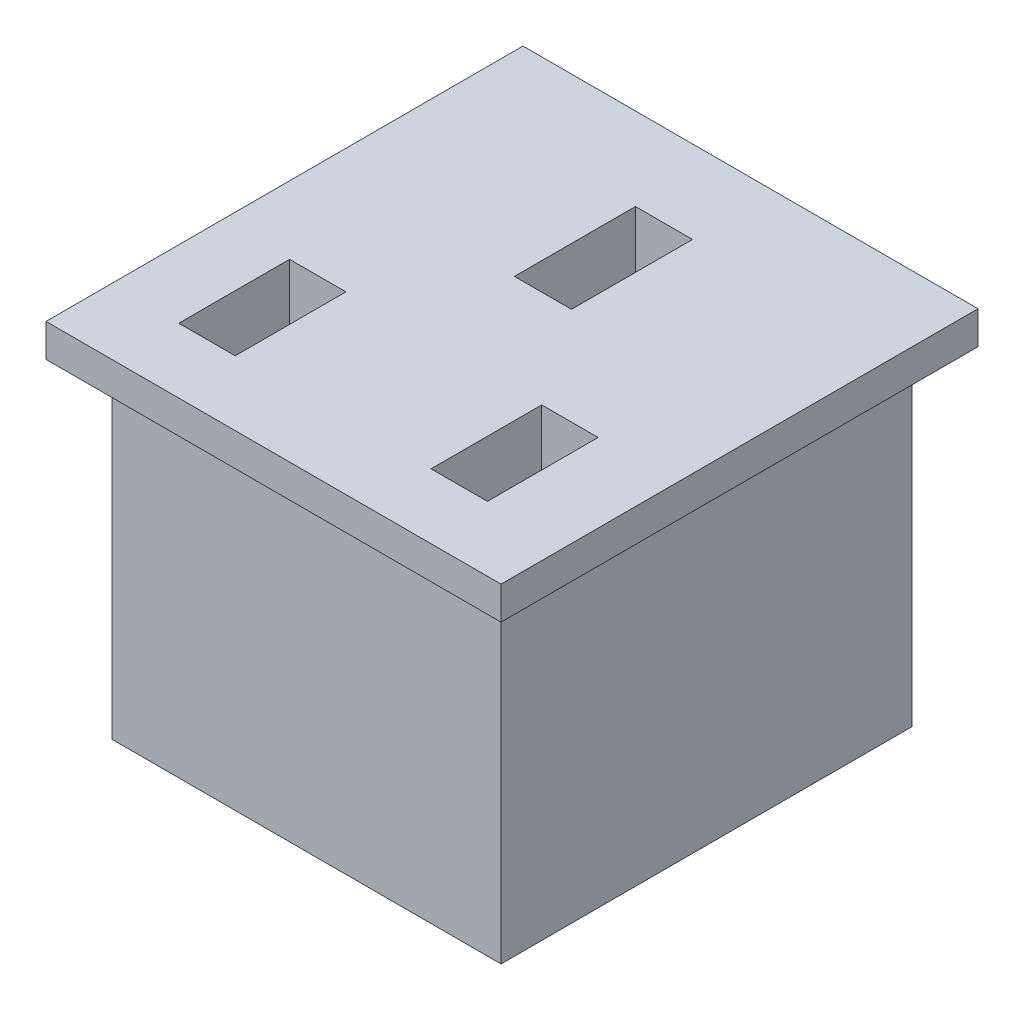
ISO-10303-21;
HEADER;
FILE_DESCRIPTION(('STEP AP214'),'2;1');
FILE_NAME('part.step','',(''),(''),'','','');
FILE_SCHEMA(('AUTOMOTIVE_DESIGN { 1 0 10303 214 1 1 1 1 }'));
ENDSEC;
DATA;
#1=APPLICATION_CONTEXT('core data for automotive mechanical design processes');
#2=APPLICATION_PROTOCOL_DEFINITION('international standard','automotive_design',2000,#1);
#3=PRODUCT_CONTEXT('',#1,'mechanical');
#4=PRODUCT('Part','Part','',(#3));
#5=PRODUCT_RELATED_PRODUCT_CATEGORY('part','',(#4));
#6=PRODUCT_DEFINITION_FORMATION('','',#4);
#7=PRODUCT_DEFINITION_CONTEXT('part definition',#1,'design');
#8=PRODUCT_DEFINITION('design','',#6,#7);
#9=PRODUCT_DEFINITION_SHAPE('','',#8);
#10=(LENGTH_UNIT() NAMED_UNIT(*) SI_UNIT(.MILLI.,.METRE.));
#11=(NAMED_UNIT(*) PLANE_ANGLE_UNIT() SI_UNIT($,.RADIAN.));
#12=(NAMED_UNIT(*) SI_UNIT($,.STERADIAN.) SOLID_ANGLE_UNIT());
#13=UNCERTAINTY_MEASURE_WITH_UNIT(LENGTH_MEASURE(1.E-05),#10,'distance_accuracy_value','');
#14=(GEOMETRIC_REPRESENTATION_CONTEXT(3) GLOBAL_UNCERTAINTY_ASSIGNED_CONTEXT((#13)) GLOBAL_UNIT_ASSIGNED_CONTEXT((#10,
#11,#12)) REPRESENTATION_CONTEXT('',''));
#15=CARTESIAN_POINT('',(0.,0.,0.));
#16=DIRECTION('',(0.,0.,1.));
#17=DIRECTION('',(1.,0.,0.));
#18=AXIS2_PLACEMENT_3D('',#15,#16,#17);
#19=CARTESIAN_POINT('',(17.75,30.,-18.75));
#20=DIRECTION('',(-1.,0.,0.));
#21=DIRECTION('',(0.,0.,1.));
#22=AXIS2_PLACEMENT_3D('',#19,#20,#21);
#23=PLANE('',#22);
#24=DIRECTION('',(0.,0.,-1.));
#25=VECTOR('',#24,1.);
#26=CARTESIAN_POINT('',(17.75,0.,-18.75));
#27=LINE('',#26,#25);
#28=CARTESIAN_POINT('',(17.75,0.,18.75));
#29=VERTEX_POINT('',#28);
#30=CARTESIAN_POINT('',(17.75,0.,-18.75));
#31=VERTEX_POINT('',#30);
#32=EDGE_CURVE('E301',#29,#31,#27,.T.);
#33=ORIENTED_EDGE('',*,*,#32,.T.);
#34=DIRECTION('',(0.,-1.,0.));
#35=VECTOR('',#34,1.);
#36=CARTESIAN_POINT('',(17.75,30.,-18.75));
#37=LINE('',#36,#35);
#38=CARTESIAN_POINT('',(17.75,30.,-18.75));
#39=VERTEX_POINT('',#38);
#40=EDGE_CURVE('E11',#39,#31,#37,.T.);
#41=ORIENTED_EDGE('',*,*,#40,.F.);
#42=DIRECTION('',(0.,0.,-1.));
#43=VECTOR('',#42,1.);
#44=CARTESIAN_POINT('',(17.75,30.,-18.75));
#45=LINE('',#44,#43);
#46=CARTESIAN_POINT('',(17.75,30.,18.75));
#47=VERTEX_POINT('',#46);
#48=EDGE_CURVE('E302',#47,#39,#45,.T.);
#49=ORIENTED_EDGE('',*,*,#48,.F.);
#50=DIRECTION('',(0.,-1.,0.));
#51=VECTOR('',#50,1.);
#52=CARTESIAN_POINT('',(17.75,30.,18.75));
#53=LINE('',#52,#51);
#54=EDGE_CURVE('E315',#47,#29,#53,.T.);
#55=ORIENTED_EDGE('',*,*,#54,.T.);
#56=EDGE_LOOP('',(#33,#41,#49,#55));
#57=FACE_BOUND('',#56,.T.);
#58=ADVANCED_FACE('F35',(#57),#23,.F.);
#59=CARTESIAN_POINT('',(-17.75,30.,-18.75));
#60=DIRECTION('',(0.,0.,1.));
#61=DIRECTION('',(1.,0.,0.));
#62=AXIS2_PLACEMENT_3D('',#59,#60,#61);
#63=PLANE('',#62);
#64=DIRECTION('',(-1.,0.,0.));
#65=VECTOR('',#64,1.);
#66=CARTESIAN_POINT('',(-17.75,0.,-18.75));
#67=LINE('',#66,#65);
#68=CARTESIAN_POINT('',(-17.75,0.,-18.75));
#69=VERTEX_POINT('',#68);
#70=EDGE_CURVE('E318',#31,#69,#67,.T.);
#71=ORIENTED_EDGE('',*,*,#70,.T.);
#72=DIRECTION('',(0.,-1.,0.));
#73=VECTOR('',#72,1.);
#74=CARTESIAN_POINT('',(-17.75,30.,-18.75));
#75=LINE('',#74,#73);
#76=CARTESIAN_POINT('',(-17.75,30.,-18.75));
#77=VERTEX_POINT('',#76);
#78=EDGE_CURVE('E42',#77,#69,#75,.T.);
#79=ORIENTED_EDGE('',*,*,#78,.F.);
#80=DIRECTION('',(-1.,0.,0.));
#81=VECTOR('',#80,1.);
#82=CARTESIAN_POINT('',(-17.75,30.,-18.75));
#83=LINE('',#82,#81);
#84=EDGE_CURVE('E305',#39,#77,#83,.T.);
#85=ORIENTED_EDGE('',*,*,#84,.F.);
#86=ORIENTED_EDGE('',*,*,#40,.T.);
#87=EDGE_LOOP('',(#71,#79,#85,#86));
#88=FACE_BOUND('',#87,.T.);
#89=ADVANCED_FACE('F345',(#88),#63,.F.);
#90=CARTESIAN_POINT('',(-17.75,30.,-18.75));
#91=DIRECTION('',(1.,0.,0.));
#92=DIRECTION('',(0.,0.,-1.));
#93=AXIS2_PLACEMENT_3D('',#90,#91,#92);
#94=PLANE('',#93);
#95=DIRECTION('',(0.,0.,1.));
#96=VECTOR('',#95,1.);
#97=CARTESIAN_POINT('',(-17.75,0.,-18.75));
#98=LINE('',#97,#96);
#99=CARTESIAN_POINT('',(-17.75,0.,18.75));
#100=VERTEX_POINT('',#99);
#101=EDGE_CURVE('E320',#69,#100,#98,.T.);
#102=ORIENTED_EDGE('',*,*,#101,.T.);
#103=DIRECTION('',(0.,-1.,0.));
#104=VECTOR('',#103,1.);
#105=CARTESIAN_POINT('',(-17.75,30.,18.75));
#106=LINE('',#105,#104);
#107=CARTESIAN_POINT('',(-17.75,30.,18.75));
#108=VERTEX_POINT('',#107);
#109=EDGE_CURVE('E325',#108,#100,#106,.T.);
#110=ORIENTED_EDGE('',*,*,#109,.F.);
#111=DIRECTION('',(0.,0.,1.));
#112=VECTOR('',#111,1.);
#113=CARTESIAN_POINT('',(-17.75,30.,-18.75));
#114=LINE('',#113,#112);
#115=EDGE_CURVE('E309',#77,#108,#114,.T.);
#116=ORIENTED_EDGE('',*,*,#115,.F.);
#117=ORIENTED_EDGE('',*,*,#78,.T.);
#118=EDGE_LOOP('',(#102,#110,#116,#117));
#119=FACE_BOUND('',#118,.T.);
#120=ADVANCED_FACE('F331',(#119),#94,.F.);
#121=CARTESIAN_POINT('',(-17.75,30.,18.75));
#122=DIRECTION('',(0.,0.,-1.));
#123=DIRECTION('',(-1.,0.,0.));
#124=AXIS2_PLACEMENT_3D('',#121,#122,#123);
#125=PLANE('',#124);
#126=DIRECTION('',(1.,0.,0.));
#127=VECTOR('',#126,1.);
#128=CARTESIAN_POINT('',(-17.75,0.,18.75));
#129=LINE('',#128,#127);
#130=EDGE_CURVE('E306',#100,#29,#129,.T.);
#131=ORIENTED_EDGE('',*,*,#130,.T.);
#132=ORIENTED_EDGE('',*,*,#54,.F.);
#133=DIRECTION('',(1.,0.,0.));
#134=VECTOR('',#133,1.);
#135=CARTESIAN_POINT('',(-17.75,30.,18.75));
#136=LINE('',#135,#134);
#137=EDGE_CURVE('E312',#108,#47,#136,.T.);
#138=ORIENTED_EDGE('',*,*,#137,.F.);
#139=ORIENTED_EDGE('',*,*,#109,.T.);
#140=EDGE_LOOP('',(#131,#132,#138,#139));
#141=FACE_BOUND('',#140,.T.);
#142=ADVANCED_FACE('F339',(#141),#125,.F.);
#143=CARTESIAN_POINT('',(0.,0.,0.));
#144=DIRECTION('',(0.,1.,0.));
#145=DIRECTION('',(0.,0.,1.));
#146=AXIS2_PLACEMENT_3D('',#143,#144,#145);
#147=PLANE('',#146);
#148=ORIENTED_EDGE('',*,*,#32,.F.);
#149=ORIENTED_EDGE('',*,*,#130,.F.);
#150=ORIENTED_EDGE('',*,*,#101,.F.);
#151=ORIENTED_EDGE('',*,*,#70,.F.);
#152=EDGE_LOOP('',(#148,#149,#150,#151));
#153=FACE_BOUND('',#152,.T.);
#154=ADVANCED_FACE('F336',(#153),#147,.F.);
#155=CARTESIAN_POINT('',(0.,30.,0.));
#156=DIRECTION('',(0.,1.,0.));
#157=DIRECTION('',(0.,0.,1.));
#158=AXIS2_PLACEMENT_3D('',#155,#156,#157);
#159=PLANE('',#158);
#160=DIRECTION('',(0.,0.,-1.));
#161=VECTOR('',#160,1.);
#162=CARTESIAN_POINT('',(20.75,30.,-21.75));
#163=LINE('',#162,#161);
#164=CARTESIAN_POINT('',(20.75,30.,21.75));
#165=VERTEX_POINT('',#164);
#166=CARTESIAN_POINT('',(20.75,30.,-21.75));
#167=VERTEX_POINT('',#166);
#168=EDGE_CURVE('E265',#165,#167,#163,.T.);
#169=ORIENTED_EDGE('',*,*,#168,.F.);
#170=DIRECTION('',(1.,0.,0.));
#171=VECTOR('',#170,1.);
#172=CARTESIAN_POINT('',(-20.75,30.,21.75));
#173=LINE('',#172,#171);
#174=CARTESIAN_POINT('',(-20.75,30.,21.75));
#175=VERTEX_POINT('',#174);
#176=EDGE_CURVE('E276',#175,#165,#173,.T.);
#177=ORIENTED_EDGE('',*,*,#176,.F.);
#178=DIRECTION('',(0.,0.,1.));
#179=VECTOR('',#178,1.);
#180=CARTESIAN_POINT('',(-20.75,30.,-21.75));
#181=LINE('',#180,#179);
#182=CARTESIAN_POINT('',(-20.75,30.,-21.75));
#183=VERTEX_POINT('',#182);
#184=EDGE_CURVE('E287',#183,#175,#181,.T.);
#185=ORIENTED_EDGE('',*,*,#184,.F.);
#186=DIRECTION('',(-1.,0.,0.));
#187=VECTOR('',#186,1.);
#188=CARTESIAN_POINT('',(-20.75,30.,-21.75));
#189=LINE('',#188,#187);
#190=EDGE_CURVE('E285',#167,#183,#189,.T.);
#191=ORIENTED_EDGE('',*,*,#190,.F.);
#192=EDGE_LOOP('',(#169,#177,#185,#191));
#193=FACE_BOUND('',#192,.T.);
#194=ORIENTED_EDGE('',*,*,#137,.T.);
#195=ORIENTED_EDGE('',*,*,#48,.T.);
#196=ORIENTED_EDGE('',*,*,#84,.T.);
#197=ORIENTED_EDGE('',*,*,#115,.T.);
#198=EDGE_LOOP('',(#194,#195,#196,#197));
#199=FACE_BOUND('',#198,.T.);
#200=ADVANCED_FACE('F344',(#193,#199),#159,.F.);
#201=CARTESIAN_POINT('',(20.75,33.,-21.75));
#202=DIRECTION('',(-1.,0.,0.));
#203=DIRECTION('',(0.,0.,1.));
#204=AXIS2_PLACEMENT_3D('',#201,#202,#203);
#205=PLANE('',#204);
#206=ORIENTED_EDGE('',*,*,#168,.T.);
#207=DIRECTION('',(0.,-1.,0.));
#208=VECTOR('',#207,1.);
#209=CARTESIAN_POINT('',(20.75,33.,-21.75));
#210=LINE('',#209,#208);
#211=CARTESIAN_POINT('',(20.75,33.,-21.75));
#212=VERTEX_POINT('',#211);
#213=EDGE_CURVE('E298',#212,#167,#210,.T.);
#214=ORIENTED_EDGE('',*,*,#213,.F.);
#215=DIRECTION('',(0.,0.,-1.));
#216=VECTOR('',#215,1.);
#217=CARTESIAN_POINT('',(20.75,33.,-21.75));
#218=LINE('',#217,#216);
#219=CARTESIAN_POINT('',(20.75,33.,21.75));
#220=VERTEX_POINT('',#219);
#221=EDGE_CURVE('E272',#220,#212,#218,.T.);
#222=ORIENTED_EDGE('',*,*,#221,.F.);
#223=DIRECTION('',(0.,-1.,0.));
#224=VECTOR('',#223,1.);
#225=CARTESIAN_POINT('',(20.75,33.,21.75));
#226=LINE('',#225,#224);
#227=EDGE_CURVE('E282',#220,#165,#226,.T.);
#228=ORIENTED_EDGE('',*,*,#227,.T.);
#229=EDGE_LOOP('',(#206,#214,#222,#228));
#230=FACE_BOUND('',#229,.T.);
#231=ADVANCED_FACE('F357',(#230),#205,.F.);
#232=CARTESIAN_POINT('',(-20.75,33.,-21.75));
#233=DIRECTION('',(0.,0.,1.));
#234=DIRECTION('',(1.,0.,0.));
#235=AXIS2_PLACEMENT_3D('',#232,#233,#234);
#236=PLANE('',#235);
#237=ORIENTED_EDGE('',*,*,#190,.T.);
#238=DIRECTION('',(0.,-1.,0.));
#239=VECTOR('',#238,1.);
#240=CARTESIAN_POINT('',(-20.75,33.,-21.75));
#241=LINE('',#240,#239);
#242=CARTESIAN_POINT('',(-20.75,33.,-21.75));
#243=VERTEX_POINT('',#242);
#244=EDGE_CURVE('E295',#243,#183,#241,.T.);
#245=ORIENTED_EDGE('',*,*,#244,.F.);
#246=DIRECTION('',(-1.,0.,0.));
#247=VECTOR('',#246,1.);
#248=CARTESIAN_POINT('',(-20.75,33.,-21.75));
#249=LINE('',#248,#247);
#250=EDGE_CURVE('E275',#212,#243,#249,.T.);
#251=ORIENTED_EDGE('',*,*,#250,.F.);
#252=ORIENTED_EDGE('',*,*,#213,.T.);
#253=EDGE_LOOP('',(#237,#245,#251,#252));
#254=FACE_BOUND('',#253,.T.);
#255=ADVANCED_FACE('F360',(#254),#236,.F.);
#256=CARTESIAN_POINT('',(-20.75,33.,-21.75));
#257=DIRECTION('',(1.,0.,0.));
#258=DIRECTION('',(0.,0.,-1.));
#259=AXIS2_PLACEMENT_3D('',#256,#257,#258);
#260=PLANE('',#259);
#261=ORIENTED_EDGE('',*,*,#184,.T.);
#262=DIRECTION('',(0.,-1.,0.));
#263=VECTOR('',#262,1.);
#264=CARTESIAN_POINT('',(-20.75,33.,21.75));
#265=LINE('',#264,#263);
#266=CARTESIAN_POINT('',(-20.75,33.,21.75));
#267=VERTEX_POINT('',#266);
#268=EDGE_CURVE('E292',#267,#175,#265,.T.);
#269=ORIENTED_EDGE('',*,*,#268,.F.);
#270=DIRECTION('',(0.,0.,1.));
#271=VECTOR('',#270,1.);
#272=CARTESIAN_POINT('',(-20.75,33.,-21.75));
#273=LINE('',#272,#271);
#274=EDGE_CURVE('E278',#243,#267,#273,.T.);
#275=ORIENTED_EDGE('',*,*,#274,.F.);
#276=ORIENTED_EDGE('',*,*,#244,.T.);
#277=EDGE_LOOP('',(#261,#269,#275,#276));
#278=FACE_BOUND('',#277,.T.);
#279=ADVANCED_FACE('F364',(#278),#260,.F.);
#280=CARTESIAN_POINT('',(-20.75,33.,21.75));
#281=DIRECTION('',(0.,0.,-1.));
#282=DIRECTION('',(-1.,0.,0.));
#283=AXIS2_PLACEMENT_3D('',#280,#281,#282);
#284=PLANE('',#283);
#285=ORIENTED_EDGE('',*,*,#176,.T.);
#286=ORIENTED_EDGE('',*,*,#227,.F.);
#287=DIRECTION('',(1.,0.,0.));
#288=VECTOR('',#287,1.);
#289=CARTESIAN_POINT('',(-20.75,33.,21.75));
#290=LINE('',#289,#288);
#291=EDGE_CURVE('E280',#267,#220,#290,.T.);
#292=ORIENTED_EDGE('',*,*,#291,.F.);
#293=ORIENTED_EDGE('',*,*,#268,.T.);
#294=EDGE_LOOP('',(#285,#286,#292,#293));
#295=FACE_BOUND('',#294,.T.);
#296=ADVANCED_FACE('F368',(#295),#284,.F.);
#297=CARTESIAN_POINT('',(0.,33.,0.));
#298=DIRECTION('',(0.,1.,0.));
#299=DIRECTION('',(0.,0.,1.));
#300=AXIS2_PLACEMENT_3D('',#297,#298,#299);
#301=PLANE('',#300);
#302=DIRECTION('',(-1.,0.,0.));
#303=VECTOR('',#302,1.);
#304=CARTESIAN_POINT('',(8.45004835957792,33.,5.73845075473536));
#305=LINE('',#304,#303);
#306=CARTESIAN_POINT('',(13.5927036807616,33.,5.73845075473536));
#307=VERTEX_POINT('',#306);
#308=CARTESIAN_POINT('',(8.45004835957792,33.,5.73845075473536));
#309=VERTEX_POINT('',#308);
#310=EDGE_CURVE('E49',#307,#309,#305,.T.);
#311=ORIENTED_EDGE('',*,*,#310,.F.);
#312=DIRECTION('',(0.,0.,-1.));
#313=VECTOR('',#312,1.);
#314=CARTESIAN_POINT('',(13.5927036807616,33.,5.73845075473536));
#315=LINE('',#314,#313);
#316=CARTESIAN_POINT('',(13.5927036807616,33.,15.8356154707179));
#317=VERTEX_POINT('',#316);
#318=EDGE_CURVE('E191',#317,#307,#315,.T.);
#319=ORIENTED_EDGE('',*,*,#318,.F.);
#320=DIRECTION('',(1.,0.,0.));
#321=VECTOR('',#320,1.);
#322=CARTESIAN_POINT('',(8.45004835957792,33.,15.8356154707179));
#323=LINE('',#322,#321);
#324=CARTESIAN_POINT('',(8.45004835957792,33.,15.8356154707179));
#325=VERTEX_POINT('',#324);
#326=EDGE_CURVE('E194',#325,#317,#323,.T.);
#327=ORIENTED_EDGE('',*,*,#326,.F.);
#328=DIRECTION('',(0.,0.,1.));
#329=VECTOR('',#328,1.);
#330=CARTESIAN_POINT('',(8.45004835957792,33.,5.73845075473536));
#331=LINE('',#330,#329);
#332=EDGE_CURVE('E200',#309,#325,#331,.T.);
#333=ORIENTED_EDGE('',*,*,#332,.F.);
#334=EDGE_LOOP('',(#311,#319,#327,#333));
#335=FACE_BOUND('',#334,.T.);
#336=DIRECTION('',(0.,0.,1.));
#337=VECTOR('',#336,1.);
#338=CARTESIAN_POINT('',(-14.5499516404221,33.,5.73845075473536));
#339=LINE('',#338,#337);
#340=CARTESIAN_POINT('',(-14.5499516404221,33.,5.73845075473536));
#341=VERTEX_POINT('',#340);
#342=CARTESIAN_POINT('',(-14.5499516404221,33.,15.8356154707179));
#343=VERTEX_POINT('',#342);
#344=EDGE_CURVE('E57',#341,#343,#339,.T.);
#345=ORIENTED_EDGE('',*,*,#344,.F.);
#346=DIRECTION('',(-1.,0.,0.));
#347=VECTOR('',#346,1.);
#348=CARTESIAN_POINT('',(-14.5499516404221,33.,5.73845075473536));
#349=LINE('',#348,#347);
#350=CARTESIAN_POINT('',(-9.40729631923842,33.,5.73845075473536));
#351=VERTEX_POINT('',#350);
#352=EDGE_CURVE('E213',#351,#341,#349,.T.);
#353=ORIENTED_EDGE('',*,*,#352,.F.);
#354=DIRECTION('',(0.,0.,-1.));
#355=VECTOR('',#354,1.);
#356=CARTESIAN_POINT('',(-9.40729631923842,33.,5.73845075473536));
#357=LINE('',#356,#355);
#358=CARTESIAN_POINT('',(-9.40729631923842,33.,15.8356154707179));
#359=VERTEX_POINT('',#358);
#360=EDGE_CURVE('E227',#359,#351,#357,.T.);
#361=ORIENTED_EDGE('',*,*,#360,.F.);
#362=DIRECTION('',(1.,0.,0.));
#363=VECTOR('',#362,1.);
#364=CARTESIAN_POINT('',(-14.5499516404221,33.,15.8356154707179));
#365=LINE('',#364,#363);
#366=EDGE_CURVE('E224',#343,#359,#365,.T.);
#367=ORIENTED_EDGE('',*,*,#366,.F.);
#368=EDGE_LOOP('',(#345,#353,#361,#367));
#369=FACE_BOUND('',#368,.T.);
#370=DIRECTION('',(0.,0.,1.));
#371=VECTOR('',#370,1.);
#372=CARTESIAN_POINT('',(-2.94761951336137,33.,-14.2050174420501));
#373=LINE('',#372,#371);
#374=CARTESIAN_POINT('',(-2.94761951336137,33.,-14.2050174420501));
#375=VERTEX_POINT('',#374);
#376=CARTESIAN_POINT('',(-2.94761951336137,33.,-3.16712309414367));
#377=VERTEX_POINT('',#376);
#378=EDGE_CURVE('E234',#375,#377,#373,.T.);
#379=ORIENTED_EDGE('',*,*,#378,.F.);
#380=DIRECTION('',(-1.,0.,0.));
#381=VECTOR('',#380,1.);
#382=CARTESIAN_POINT('',(-2.94761951336137,33.,-14.2050174420501));
#383=LINE('',#382,#381);
#384=CARTESIAN_POINT('',(2.25775111661722,33.,-14.2050174420501));
#385=VERTEX_POINT('',#384);
#386=EDGE_CURVE('E244',#385,#375,#383,.T.);
#387=ORIENTED_EDGE('',*,*,#386,.F.);
#388=DIRECTION('',(0.,0.,-1.));
#389=VECTOR('',#388,1.);
#390=CARTESIAN_POINT('',(2.25775111661722,33.,-14.2050174420501));
#391=LINE('',#390,#389);
#392=CARTESIAN_POINT('',(2.25775111661722,33.,-3.16712309414367));
#393=VERTEX_POINT('',#392);
#394=EDGE_CURVE('E258',#393,#385,#391,.T.);
#395=ORIENTED_EDGE('',*,*,#394,.F.);
#396=DIRECTION('',(1.,0.,0.));
#397=VECTOR('',#396,1.);
#398=CARTESIAN_POINT('',(-2.94761951336137,33.,-3.16712309414367));
#399=LINE('',#398,#397);
#400=EDGE_CURVE('E255',#377,#393,#399,.T.);
#401=ORIENTED_EDGE('',*,*,#400,.F.);
#402=EDGE_LOOP('',(#379,#387,#395,#401));
#403=FACE_BOUND('',#402,.T.);
#404=ORIENTED_EDGE('',*,*,#221,.T.);
#405=ORIENTED_EDGE('',*,*,#250,.T.);
#406=ORIENTED_EDGE('',*,*,#274,.T.);
#407=ORIENTED_EDGE('',*,*,#291,.T.);
#408=EDGE_LOOP('',(#404,#405,#406,#407));
#409=FACE_BOUND('',#408,.T.);
#410=ADVANCED_FACE('F372',(#335,#369,#403,#409),#301,.T.);
#411=CARTESIAN_POINT('',(-2.94761951336137,8.,-14.2050174420501));
#412=DIRECTION('',(-1.,0.,0.));
#413=DIRECTION('',(0.,0.,1.));
#414=AXIS2_PLACEMENT_3D('',#411,#412,#413);
#415=PLANE('',#414);
#416=ORIENTED_EDGE('',*,*,#378,.T.);
#417=DIRECTION('',(0.,1.,0.));
#418=VECTOR('',#417,1.);
#419=CARTESIAN_POINT('',(-2.94761951336137,8.,-3.16712309414367));
#420=LINE('',#419,#418);
#421=CARTESIAN_POINT('',(-2.94761951336137,8.,-3.16712309414367));
#422=VERTEX_POINT('',#421);
#423=EDGE_CURVE('E253',#422,#377,#420,.T.);
#424=ORIENTED_EDGE('',*,*,#423,.F.);
#425=DIRECTION('',(0.,0.,1.));
#426=VECTOR('',#425,1.);
#427=CARTESIAN_POINT('',(-2.94761951336137,8.,-14.2050174420501));
#428=LINE('',#427,#426);
#429=CARTESIAN_POINT('',(-2.94761951336137,8.,-14.2050174420501));
#430=VERTEX_POINT('',#429);
#431=EDGE_CURVE('E240',#430,#422,#428,.T.);
#432=ORIENTED_EDGE('',*,*,#431,.F.);
#433=DIRECTION('',(0.,1.,0.));
#434=VECTOR('',#433,1.);
#435=CARTESIAN_POINT('',(-2.94761951336137,8.,-14.2050174420501));
#436=LINE('',#435,#434);
#437=EDGE_CURVE('E263',#430,#375,#436,.T.);
#438=ORIENTED_EDGE('',*,*,#437,.T.);
#439=EDGE_LOOP('',(#416,#424,#432,#438));
#440=FACE_BOUND('',#439,.T.);
#441=ADVANCED_FACE('F379',(#440),#415,.F.);
#442=CARTESIAN_POINT('',(-2.94761951336137,8.,-14.2050174420501));
#443=DIRECTION('',(0.,0.,-1.));
#444=DIRECTION('',(-1.,0.,0.));
#445=AXIS2_PLACEMENT_3D('',#442,#443,#444);
#446=PLANE('',#445);
#447=ORIENTED_EDGE('',*,*,#386,.T.);
#448=ORIENTED_EDGE('',*,*,#437,.F.);
#449=DIRECTION('',(-1.,0.,0.));
#450=VECTOR('',#449,1.);
#451=CARTESIAN_POINT('',(-2.94761951336137,8.,-14.2050174420501));
#452=LINE('',#451,#450);
#453=CARTESIAN_POINT('',(2.25775111661722,8.,-14.2050174420501));
#454=VERTEX_POINT('',#453);
#455=EDGE_CURVE('E250',#454,#430,#452,.T.);
#456=ORIENTED_EDGE('',*,*,#455,.F.);
#457=DIRECTION('',(0.,1.,0.));
#458=VECTOR('',#457,1.);
#459=CARTESIAN_POINT('',(2.25775111661722,8.,-14.2050174420501));
#460=LINE('',#459,#458);
#461=EDGE_CURVE('E266',#454,#385,#460,.T.);
#462=ORIENTED_EDGE('',*,*,#461,.T.);
#463=EDGE_LOOP('',(#447,#448,#456,#462));
#464=FACE_BOUND('',#463,.T.);
#465=ADVANCED_FACE('F383',(#464),#446,.F.);
#466=CARTESIAN_POINT('',(2.25775111661722,8.,-14.2050174420501));
#467=DIRECTION('',(1.,0.,0.));
#468=DIRECTION('',(0.,0.,-1.));
#469=AXIS2_PLACEMENT_3D('',#466,#467,#468);
#470=PLANE('',#469);
#471=ORIENTED_EDGE('',*,*,#394,.T.);
#472=ORIENTED_EDGE('',*,*,#461,.F.);
#473=DIRECTION('',(0.,0.,-1.));
#474=VECTOR('',#473,1.);
#475=CARTESIAN_POINT('',(2.25775111661722,8.,-14.2050174420501));
#476=LINE('',#475,#474);
#477=CARTESIAN_POINT('',(2.25775111661722,8.,-3.16712309414367));
#478=VERTEX_POINT('',#477);
#479=EDGE_CURVE('E247',#478,#454,#476,.T.);
#480=ORIENTED_EDGE('',*,*,#479,.F.);
#481=DIRECTION('',(0.,1.,0.));
#482=VECTOR('',#481,1.);
#483=CARTESIAN_POINT('',(2.25775111661722,8.,-3.16712309414367));
#484=LINE('',#483,#482);
#485=EDGE_CURVE('E268',#478,#393,#484,.T.);
#486=ORIENTED_EDGE('',*,*,#485,.T.);
#487=EDGE_LOOP('',(#471,#472,#480,#486));
#488=FACE_BOUND('',#487,.T.);
#489=ADVANCED_FACE('F389',(#488),#470,.F.);
#490=CARTESIAN_POINT('',(-2.94761951336137,8.,-3.16712309414367));
#491=DIRECTION('',(0.,0.,1.));
#492=DIRECTION('',(1.,0.,0.));
#493=AXIS2_PLACEMENT_3D('',#490,#491,#492);
#494=PLANE('',#493);
#495=ORIENTED_EDGE('',*,*,#400,.T.);
#496=ORIENTED_EDGE('',*,*,#485,.F.);
#497=DIRECTION('',(1.,0.,0.));
#498=VECTOR('',#497,1.);
#499=CARTESIAN_POINT('',(-2.94761951336137,8.,-3.16712309414367));
#500=LINE('',#499,#498);
#501=EDGE_CURVE('E243',#422,#478,#500,.T.);
#502=ORIENTED_EDGE('',*,*,#501,.F.);
#503=ORIENTED_EDGE('',*,*,#423,.T.);
#504=EDGE_LOOP('',(#495,#496,#502,#503));
#505=FACE_BOUND('',#504,.T.);
#506=ADVANCED_FACE('F385',(#505),#494,.F.);
#507=CARTESIAN_POINT('',(0.,8.,0.));
#508=DIRECTION('',(0.,1.,0.));
#509=DIRECTION('',(0.,0.,1.));
#510=AXIS2_PLACEMENT_3D('',#507,#508,#509);
#511=PLANE('',#510);
#512=ORIENTED_EDGE('',*,*,#431,.T.);
#513=ORIENTED_EDGE('',*,*,#501,.T.);
#514=ORIENTED_EDGE('',*,*,#479,.T.);
#515=ORIENTED_EDGE('',*,*,#455,.T.);
#516=EDGE_LOOP('',(#512,#513,#514,#515));
#517=FACE_BOUND('',#516,.T.);
#518=ADVANCED_FACE('F388',(#517),#511,.T.);
#519=CARTESIAN_POINT('',(-14.5499516404221,8.,5.73845075473536));
#520=DIRECTION('',(-1.,0.,0.));
#521=DIRECTION('',(0.,0.,1.));
#522=AXIS2_PLACEMENT_3D('',#519,#520,#521);
#523=PLANE('',#522);
#524=ORIENTED_EDGE('',*,*,#344,.T.);
#525=DIRECTION('',(0.,1.,0.));
#526=VECTOR('',#525,1.);
#527=CARTESIAN_POINT('',(-14.5499516404221,8.,15.8356154707179));
#528=LINE('',#527,#526);
#529=CARTESIAN_POINT('',(-14.5499516404221,8.,15.8356154707179));
#530=VERTEX_POINT('',#529);
#531=EDGE_CURVE('E222',#530,#343,#528,.T.);
#532=ORIENTED_EDGE('',*,*,#531,.F.);
#533=DIRECTION('',(0.,0.,1.));
#534=VECTOR('',#533,1.);
#535=CARTESIAN_POINT('',(-14.5499516404221,8.,5.73845075473536));
#536=LINE('',#535,#534);
#537=CARTESIAN_POINT('',(-14.5499516404221,8.,5.73845075473536));
#538=VERTEX_POINT('',#537);
#539=EDGE_CURVE('E209',#538,#530,#536,.T.);
#540=ORIENTED_EDGE('',*,*,#539,.F.);
#541=DIRECTION('',(0.,1.,0.));
#542=VECTOR('',#541,1.);
#543=CARTESIAN_POINT('',(-14.5499516404221,8.,5.73845075473536));
#544=LINE('',#543,#542);
#545=EDGE_CURVE('E232',#538,#341,#544,.T.);
#546=ORIENTED_EDGE('',*,*,#545,.T.);
#547=EDGE_LOOP('',(#524,#532,#540,#546));
#548=FACE_BOUND('',#547,.T.);
#549=ADVANCED_FACE('F399',(#548),#523,.F.);
#550=CARTESIAN_POINT('',(-14.5499516404221,8.,5.73845075473536));
#551=DIRECTION('',(0.,0.,-1.));
#552=DIRECTION('',(-1.,0.,0.));
#553=AXIS2_PLACEMENT_3D('',#550,#551,#552);
#554=PLANE('',#553);
#555=ORIENTED_EDGE('',*,*,#352,.T.);
#556=ORIENTED_EDGE('',*,*,#545,.F.);
#557=DIRECTION('',(-1.,0.,0.));
#558=VECTOR('',#557,1.);
#559=CARTESIAN_POINT('',(-14.5499516404221,8.,5.73845075473536));
#560=LINE('',#559,#558);
#561=CARTESIAN_POINT('',(-9.40729631923842,8.,5.73845075473536));
#562=VERTEX_POINT('',#561);
#563=EDGE_CURVE('E219',#562,#538,#560,.T.);
#564=ORIENTED_EDGE('',*,*,#563,.F.);
#565=DIRECTION('',(0.,1.,0.));
#566=VECTOR('',#565,1.);
#567=CARTESIAN_POINT('',(-9.40729631923842,8.,5.73845075473536));
#568=LINE('',#567,#566);
#569=EDGE_CURVE('E235',#562,#351,#568,.T.);
#570=ORIENTED_EDGE('',*,*,#569,.T.);
#571=EDGE_LOOP('',(#555,#556,#564,#570));
#572=FACE_BOUND('',#571,.T.);
#573=ADVANCED_FACE('F403',(#572),#554,.F.);
#574=CARTESIAN_POINT('',(-9.40729631923842,8.,5.73845075473536));
#575=DIRECTION('',(1.,0.,0.));
#576=DIRECTION('',(0.,0.,-1.));
#577=AXIS2_PLACEMENT_3D('',#574,#575,#576);
#578=PLANE('',#577);
#579=ORIENTED_EDGE('',*,*,#360,.T.);
#580=ORIENTED_EDGE('',*,*,#569,.F.);
#581=DIRECTION('',(0.,0.,-1.));
#582=VECTOR('',#581,1.);
#583=CARTESIAN_POINT('',(-9.40729631923842,8.,5.73845075473536));
#584=LINE('',#583,#582);
#585=CARTESIAN_POINT('',(-9.40729631923842,8.,15.8356154707179));
#586=VERTEX_POINT('',#585);
#587=EDGE_CURVE('E216',#586,#562,#584,.T.);
#588=ORIENTED_EDGE('',*,*,#587,.F.);
#589=DIRECTION('',(0.,1.,0.));
#590=VECTOR('',#589,1.);
#591=CARTESIAN_POINT('',(-9.40729631923842,8.,15.8356154707179));
#592=LINE('',#591,#590);
#593=EDGE_CURVE('E237',#586,#359,#592,.T.);
#594=ORIENTED_EDGE('',*,*,#593,.T.);
#595=EDGE_LOOP('',(#579,#580,#588,#594));
#596=FACE_BOUND('',#595,.T.);
#597=ADVANCED_FACE('F408',(#596),#578,.F.);
#598=CARTESIAN_POINT('',(-14.5499516404221,8.,15.8356154707179));
#599=DIRECTION('',(0.,0.,1.));
#600=DIRECTION('',(1.,0.,0.));
#601=AXIS2_PLACEMENT_3D('',#598,#599,#600);
#602=PLANE('',#601);
#603=ORIENTED_EDGE('',*,*,#366,.T.);
#604=ORIENTED_EDGE('',*,*,#593,.F.);
#605=DIRECTION('',(1.,0.,0.));
#606=VECTOR('',#605,1.);
#607=CARTESIAN_POINT('',(-14.5499516404221,8.,15.8356154707179));
#608=LINE('',#607,#606);
#609=EDGE_CURVE('E212',#530,#586,#608,.T.);
#610=ORIENTED_EDGE('',*,*,#609,.F.);
#611=ORIENTED_EDGE('',*,*,#531,.T.);
#612=EDGE_LOOP('',(#603,#604,#610,#611));
#613=FACE_BOUND('',#612,.T.);
#614=ADVANCED_FACE('F404',(#613),#602,.F.);
#615=CARTESIAN_POINT('',(0.,8.,0.));
#616=DIRECTION('',(0.,1.,0.));
#617=DIRECTION('',(0.,0.,1.));
#618=AXIS2_PLACEMENT_3D('',#615,#616,#617);
#619=PLANE('',#618);
#620=ORIENTED_EDGE('',*,*,#539,.T.);
#621=ORIENTED_EDGE('',*,*,#609,.T.);
#622=ORIENTED_EDGE('',*,*,#587,.T.);
#623=ORIENTED_EDGE('',*,*,#563,.T.);
#624=EDGE_LOOP('',(#620,#621,#622,#623));
#625=FACE_BOUND('',#624,.T.);
#626=ADVANCED_FACE('F407',(#625),#619,.T.);
#627=CARTESIAN_POINT('',(8.45004835957792,8.,5.73845075473536));
#628=DIRECTION('',(0.,0.,-1.));
#629=DIRECTION('',(-1.,0.,0.));
#630=AXIS2_PLACEMENT_3D('',#627,#628,#629);
#631=PLANE('',#630);
#632=ORIENTED_EDGE('',*,*,#310,.T.);
#633=DIRECTION('',(0.,1.,0.));
#634=VECTOR('',#633,1.);
#635=CARTESIAN_POINT('',(8.45004835957792,8.,5.73845075473536));
#636=LINE('',#635,#634);
#637=CARTESIAN_POINT('',(8.45004835957792,8.,5.73845075473536));
#638=VERTEX_POINT('',#637);
#639=EDGE_CURVE('E169',#638,#309,#636,.T.);
#640=ORIENTED_EDGE('',*,*,#639,.F.);
#641=DIRECTION('',(-1.,0.,0.));
#642=VECTOR('',#641,1.);
#643=CARTESIAN_POINT('',(8.45004835957792,8.,5.73845075473536));
#644=LINE('',#643,#642);
#645=CARTESIAN_POINT('',(13.5927036807616,8.,5.73845075473536));
#646=VERTEX_POINT('',#645);
#647=EDGE_CURVE('E173',#646,#638,#644,.T.);
#648=ORIENTED_EDGE('',*,*,#647,.F.);
#649=DIRECTION('',(0.,1.,0.));
#650=VECTOR('',#649,1.);
#651=CARTESIAN_POINT('',(13.5927036807616,8.,5.73845075473536));
#652=LINE('',#651,#650);
#653=EDGE_CURVE('E204',#646,#307,#652,.T.);
#654=ORIENTED_EDGE('',*,*,#653,.T.);
#655=EDGE_LOOP('',(#632,#640,#648,#654));
#656=FACE_BOUND('',#655,.T.);
#657=ADVANCED_FACE('F171',(#656),#631,.F.);
#658=CARTESIAN_POINT('',(13.5927036807616,8.,5.73845075473536));
#659=DIRECTION('',(1.,0.,0.));
#660=DIRECTION('',(0.,0.,-1.));
#661=AXIS2_PLACEMENT_3D('',#658,#659,#660);
#662=PLANE('',#661);
#663=ORIENTED_EDGE('',*,*,#318,.T.);
#664=ORIENTED_EDGE('',*,*,#653,.F.);
#665=DIRECTION('',(0.,0.,-1.));
#666=VECTOR('',#665,1.);
#667=CARTESIAN_POINT('',(13.5927036807616,8.,5.73845075473536));
#668=LINE('',#667,#666);
#669=CARTESIAN_POINT('',(13.5927036807616,8.,15.8356154707179));
#670=VERTEX_POINT('',#669);
#671=EDGE_CURVE('E179',#670,#646,#668,.T.);
#672=ORIENTED_EDGE('',*,*,#671,.F.);
#673=DIRECTION('',(0.,1.,0.));
#674=VECTOR('',#673,1.);
#675=CARTESIAN_POINT('',(13.5927036807616,8.,15.8356154707179));
#676=LINE('',#675,#674);
#677=EDGE_CURVE('E206',#670,#317,#676,.T.);
#678=ORIENTED_EDGE('',*,*,#677,.T.);
#679=EDGE_LOOP('',(#663,#664,#672,#678));
#680=FACE_BOUND('',#679,.T.);
#681=ADVANCED_FACE('F421',(#680),#662,.F.);
#682=CARTESIAN_POINT('',(8.45004835957792,8.,15.8356154707179));
#683=DIRECTION('',(0.,0.,1.));
#684=DIRECTION('',(1.,0.,0.));
#685=AXIS2_PLACEMENT_3D('',#682,#683,#684);
#686=PLANE('',#685);
#687=ORIENTED_EDGE('',*,*,#326,.T.);
#688=ORIENTED_EDGE('',*,*,#677,.F.);
#689=DIRECTION('',(1.,0.,0.));
#690=VECTOR('',#689,1.);
#691=CARTESIAN_POINT('',(8.45004835957792,8.,15.8356154707179));
#692=LINE('',#691,#690);
#693=CARTESIAN_POINT('',(8.45004835957792,8.,15.8356154707179));
#694=VERTEX_POINT('',#693);
#695=EDGE_CURVE('E187',#694,#670,#692,.T.);
#696=ORIENTED_EDGE('',*,*,#695,.F.);
#697=DIRECTION('',(0.,1.,0.));
#698=VECTOR('',#697,1.);
#699=CARTESIAN_POINT('',(8.45004835957792,8.,15.8356154707179));
#700=LINE('',#699,#698);
#701=EDGE_CURVE('E178',#694,#325,#700,.T.);
#702=ORIENTED_EDGE('',*,*,#701,.T.);
#703=EDGE_LOOP('',(#687,#688,#696,#702));
#704=FACE_BOUND('',#703,.T.);
#705=ADVANCED_FACE('F424',(#704),#686,.F.);
#706=CARTESIAN_POINT('',(8.45004835957792,8.,5.73845075473536));
#707=DIRECTION('',(-1.,0.,0.));
#708=DIRECTION('',(0.,0.,1.));
#709=AXIS2_PLACEMENT_3D('',#706,#707,#708);
#710=PLANE('',#709);
#711=ORIENTED_EDGE('',*,*,#332,.T.);
#712=ORIENTED_EDGE('',*,*,#701,.F.);
#713=DIRECTION('',(0.,0.,1.));
#714=VECTOR('',#713,1.);
#715=CARTESIAN_POINT('',(8.45004835957792,8.,5.73845075473536));
#716=LINE('',#715,#714);
#717=EDGE_CURVE('E182',#638,#694,#716,.T.);
#718=ORIENTED_EDGE('',*,*,#717,.F.);
#719=ORIENTED_EDGE('',*,*,#639,.T.);
#720=EDGE_LOOP('',(#711,#712,#718,#719));
#721=FACE_BOUND('',#720,.T.);
#722=ADVANCED_FACE('F183',(#721),#710,.F.);
#723=CARTESIAN_POINT('',(0.,8.,0.));
#724=DIRECTION('',(0.,-1.,0.));
#725=DIRECTION('',(0.,0.,-1.));
#726=AXIS2_PLACEMENT_3D('',#723,#724,#725);
#727=PLANE('',#726);
#728=ORIENTED_EDGE('',*,*,#647,.T.);
#729=ORIENTED_EDGE('',*,*,#717,.T.);
#730=ORIENTED_EDGE('',*,*,#695,.T.);
#731=ORIENTED_EDGE('',*,*,#671,.T.);
#732=EDGE_LOOP('',(#728,#729,#730,#731));
#733=FACE_BOUND('',#732,.T.);
#734=ADVANCED_FACE('F189',(#733),#727,.F.);
#735=CLOSED_SHELL('',(#58,#89,#120,#142,#154,#200,#231,#255,#279,#296,#410,#441,#465,#489,#506,
#518,#549,#573,#597,#614,#626,#657,#681,#705,#722,#734));
#736=MANIFOLD_SOLID_BREP('B2',#735);
#737=ADVANCED_BREP_SHAPE_REPRESENTATION('',(#18,#736),#14);
#738=SHAPE_DEFINITION_REPRESENTATION(#9,#737);
ENDSEC;
END-ISO-10303-21;
